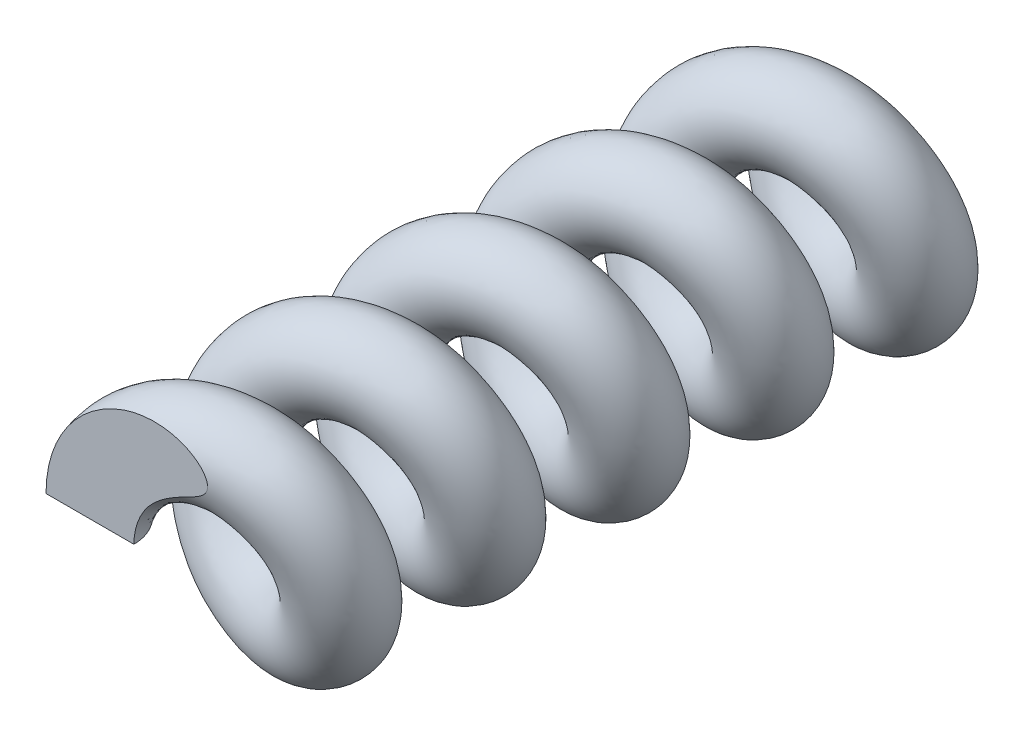
ISO-10303-21;
HEADER;
FILE_DESCRIPTION(('STEP AP214'),'2;1');
FILE_NAME('part.step','',(''),(''),'','','');
FILE_SCHEMA(('AUTOMOTIVE_DESIGN { 1 0 10303 214 1 1 1 1 }'));
ENDSEC;
DATA;
#1=APPLICATION_CONTEXT('core data for automotive mechanical design processes');
#2=APPLICATION_PROTOCOL_DEFINITION('international standard','automotive_design',2000,#1);
#3=PRODUCT_CONTEXT('',#1,'mechanical');
#4=PRODUCT('Part','Part','',(#3));
#5=PRODUCT_RELATED_PRODUCT_CATEGORY('part','',(#4));
#6=PRODUCT_DEFINITION_FORMATION('','',#4);
#7=PRODUCT_DEFINITION_CONTEXT('part definition',#1,'design');
#8=PRODUCT_DEFINITION('design','',#6,#7);
#9=PRODUCT_DEFINITION_SHAPE('','',#8);
#10=(LENGTH_UNIT() NAMED_UNIT(*) SI_UNIT(.MILLI.,.METRE.));
#11=(NAMED_UNIT(*) PLANE_ANGLE_UNIT() SI_UNIT($,.RADIAN.));
#12=(NAMED_UNIT(*) SI_UNIT($,.STERADIAN.) SOLID_ANGLE_UNIT());
#13=UNCERTAINTY_MEASURE_WITH_UNIT(LENGTH_MEASURE(1.E-05),#10,'distance_accuracy_value','');
#14=(GEOMETRIC_REPRESENTATION_CONTEXT(3) GLOBAL_UNCERTAINTY_ASSIGNED_CONTEXT((#13)) GLOBAL_UNIT_ASSIGNED_CONTEXT((#10,
#11,#12)) REPRESENTATION_CONTEXT('',''));
#15=CARTESIAN_POINT('',(0.,0.,0.));
#16=DIRECTION('',(0.,0.,1.));
#17=DIRECTION('',(1.,0.,0.));
#18=AXIS2_PLACEMENT_3D('',#15,#16,#17);
#19=CARTESIAN_POINT('',(-0.5,0.,0.));
#20=DIRECTION('',(0.,1.,0.));
#21=DIRECTION('',(0.,0.,1.));
#22=AXIS2_PLACEMENT_3D('',#19,#20,#21);
#23=PLANE('',#22);
#24=DIRECTION('',(1.,0.,0.));
#25=VECTOR('',#24,1.);
#26=CARTESIAN_POINT('',(-0.5,0.,0.));
#27=LINE('',#26,#25);
#28=CARTESIAN_POINT('',(-0.75,0.,0.));
#29=VERTEX_POINT('',#28);
#30=CARTESIAN_POINT('',(-0.25,0.,0.));
#31=VERTEX_POINT('',#30);
#32=EDGE_CURVE('E55',#29,#31,#27,.T.);
#33=ORIENTED_EDGE('',*,*,#32,.F.);
#34=CARTESIAN_POINT('',(-0.5,0.,0.));
#35=DIRECTION('',(0.,1.,0.));
#36=DIRECTION('',(0.,0.,1.));
#37=AXIS2_PLACEMENT_3D('',#34,#35,#36);
#38=CIRCLE('',#37,0.25);
#39=EDGE_CURVE('E70',#31,#29,#38,.T.);
#40=ORIENTED_EDGE('',*,*,#39,.F.);
#41=EDGE_LOOP('',(#33,#40));
#42=FACE_BOUND('',#41,.T.);
#43=ADVANCED_FACE('F36',(#42),#23,.F.);
#44=CARTESIAN_POINT('',(-0.5,0.,0.25));
#45=CARTESIAN_POINT('',(-0.5,0.288675134594813,0.181729812479405));
#46=CARTESIAN_POINT('',(-0.25,0.433012701892219,0.11345962495881));
#47=CARTESIAN_POINT('',(0.,0.577350269189626,0.0451894374382147));
#48=CARTESIAN_POINT('',(0.25,0.433012701892219,-0.0230807500823805));
#49=CARTESIAN_POINT('',(0.5,0.288675134594813,-0.0913509376029756));
#50=CARTESIAN_POINT('',(0.5,0.,-0.159621125123571));
#51=CARTESIAN_POINT('',(0.5,-0.288675134594813,-0.227891312644166));
#52=CARTESIAN_POINT('',(0.25,-0.433012701892219,-0.296161500164761));
#53=CARTESIAN_POINT('',(0.,-0.577350269189626,-0.364431687685356));
#54=CARTESIAN_POINT('',(-0.25,-0.43301270189222,-0.432701875205951));
#55=CARTESIAN_POINT('',(-0.5,-0.288675134594813,-0.500972062726546));
#56=CARTESIAN_POINT('',(-0.5,0.,-0.569242250247142));
#57=CARTESIAN_POINT('',(-0.5,0.288675134594813,-0.637512437767737));
#58=CARTESIAN_POINT('',(-0.25,0.433012701892219,-0.705782625288332));
#59=CARTESIAN_POINT('',(0.,0.577350269189626,-0.774052812808927));
#60=CARTESIAN_POINT('',(0.25,0.433012701892219,-0.842323000329522));
#61=CARTESIAN_POINT('',(0.5,0.288675134594813,-0.910593187850117));
#62=CARTESIAN_POINT('',(0.5,0.,-0.978863375370712));
#63=CARTESIAN_POINT('',(0.5,-0.288675134594813,-1.04713356289131));
#64=CARTESIAN_POINT('',(0.25,-0.433012701892219,-1.1154037504119));
#65=CARTESIAN_POINT('',(0.,-0.577350269189626,-1.1836739379325));
#66=CARTESIAN_POINT('',(-0.25,-0.43301270189222,-1.25194412545309));
#67=CARTESIAN_POINT('',(-0.5,-0.288675134594813,-1.32021431297369));
#68=CARTESIAN_POINT('',(-0.5,0.,-1.38848450049428));
#69=CARTESIAN_POINT('',(-0.5,0.288675134594813,-1.45675468801488));
#70=CARTESIAN_POINT('',(-0.25,0.433012701892219,-1.52502487553547));
#71=CARTESIAN_POINT('',(0.,0.577350269189626,-1.59329506305607));
#72=CARTESIAN_POINT('',(0.25,0.433012701892219,-1.66156525057666));
#73=CARTESIAN_POINT('',(0.5,0.288675134594813,-1.72983543809726));
#74=CARTESIAN_POINT('',(0.5,0.,-1.79810562561785));
#75=CARTESIAN_POINT('',(0.5,-0.288675134594813,-1.86637581313845));
#76=CARTESIAN_POINT('',(0.25,-0.433012701892219,-1.93464600065904));
#77=CARTESIAN_POINT('',(0.,-0.577350269189626,-2.00291618817964));
#78=CARTESIAN_POINT('',(-0.25,-0.43301270189222,-2.07118637570023));
#79=CARTESIAN_POINT('',(-0.5,-0.288675134594813,-2.13945656322083));
#80=CARTESIAN_POINT('',(-0.5,0.,-2.20772675074143));
#81=CARTESIAN_POINT('',(-0.5,0.288675134594813,-2.27599693826202));
#82=CARTESIAN_POINT('',(-0.25,0.433012701892219,-2.34426712578262));
#83=CARTESIAN_POINT('',(0.,0.577350269189626,-2.41253731330321));
#84=CARTESIAN_POINT('',(0.25,0.433012701892219,-2.48080750082381));
#85=CARTESIAN_POINT('',(0.5,0.288675134594813,-2.5490776883444));
#86=CARTESIAN_POINT('',(0.5,0.,-2.617347875865));
#87=CARTESIAN_POINT('',(0.5,-0.288675134594813,-2.68561806338559));
#88=CARTESIAN_POINT('',(0.25,-0.433012701892219,-2.75388825090619));
#89=CARTESIAN_POINT('',(0.,-0.577350269189626,-2.82215843842678));
#90=CARTESIAN_POINT('',(-0.25,-0.43301270189222,-2.89042862594738));
#91=CARTESIAN_POINT('',(-0.5,-0.288675134594813,-2.95869881346797));
#92=CARTESIAN_POINT('',(-0.5,0.,-3.02696900098857));
#93=CARTESIAN_POINT('',(-0.5,0.288675134594813,-3.09523918850916));
#94=CARTESIAN_POINT('',(-0.25,0.433012701892219,-3.16350937602976));
#95=CARTESIAN_POINT('',(0.,0.577350269189626,-3.23177956355035));
#96=CARTESIAN_POINT('',(0.25,0.433012701892219,-3.30004975107095));
#97=CARTESIAN_POINT('',(0.5,0.288675134594813,-3.36831993859154));
#98=CARTESIAN_POINT('',(0.5,0.,-3.43659012611214));
#99=CARTESIAN_POINT('',(0.5,-0.288675134594813,-3.50486031363273));
#100=CARTESIAN_POINT('',(0.25,-0.433012701892219,-3.57313050115333));
#101=CARTESIAN_POINT('',(0.,-0.577350269189626,-3.64140068867392));
#102=CARTESIAN_POINT('',(-0.25,-0.43301270189222,-3.70967087619452));
#103=CARTESIAN_POINT('',(-0.5,-0.288675134594813,-3.77794106371511));
#104=CARTESIAN_POINT('',(-0.5,0.,-3.84621125123571));
#105=CARTESIAN_POINT('',(0.,0.,0.25));
#106=CARTESIAN_POINT('',(0.,0.,0.181729812479405));
#107=CARTESIAN_POINT('',(0.,0.,0.11345962495881));
#108=CARTESIAN_POINT('',(0.,0.,0.0451894374382147));
#109=CARTESIAN_POINT('',(0.,0.,-0.0230807500823805));
#110=CARTESIAN_POINT('',(0.,0.,-0.0913509376029756));
#111=CARTESIAN_POINT('',(0.,0.,-0.159621125123571));
#112=CARTESIAN_POINT('',(0.,0.,-0.227891312644166));
#113=CARTESIAN_POINT('',(0.,0.,-0.296161500164761));
#114=CARTESIAN_POINT('',(0.,0.,-0.364431687685356));
#115=CARTESIAN_POINT('',(0.,0.,-0.432701875205951));
#116=CARTESIAN_POINT('',(0.,0.,-0.500972062726546));
#117=CARTESIAN_POINT('',(0.,0.,-0.569242250247142));
#118=CARTESIAN_POINT('',(0.,0.,-0.637512437767737));
#119=CARTESIAN_POINT('',(0.,0.,-0.705782625288332));
#120=CARTESIAN_POINT('',(0.,0.,-0.774052812808927));
#121=CARTESIAN_POINT('',(0.,0.,-0.842323000329522));
#122=CARTESIAN_POINT('',(0.,0.,-0.910593187850117));
#123=CARTESIAN_POINT('',(0.,0.,-0.978863375370712));
#124=CARTESIAN_POINT('',(0.,0.,-1.04713356289131));
#125=CARTESIAN_POINT('',(0.,0.,-1.1154037504119));
#126=CARTESIAN_POINT('',(0.,0.,-1.1836739379325));
#127=CARTESIAN_POINT('',(0.,0.,-1.25194412545309));
#128=CARTESIAN_POINT('',(0.,0.,-1.32021431297369));
#129=CARTESIAN_POINT('',(0.,0.,-1.38848450049428));
#130=CARTESIAN_POINT('',(0.,0.,-1.45675468801488));
#131=CARTESIAN_POINT('',(0.,0.,-1.52502487553547));
#132=CARTESIAN_POINT('',(0.,0.,-1.59329506305607));
#133=CARTESIAN_POINT('',(0.,0.,-1.66156525057666));
#134=CARTESIAN_POINT('',(0.,0.,-1.72983543809726));
#135=CARTESIAN_POINT('',(0.,0.,-1.79810562561785));
#136=CARTESIAN_POINT('',(0.,0.,-1.86637581313845));
#137=CARTESIAN_POINT('',(0.,0.,-1.93464600065904));
#138=CARTESIAN_POINT('',(0.,0.,-2.00291618817964));
#139=CARTESIAN_POINT('',(0.,0.,-2.07118637570023));
#140=CARTESIAN_POINT('',(0.,0.,-2.13945656322083));
#141=CARTESIAN_POINT('',(0.,0.,-2.20772675074143));
#142=CARTESIAN_POINT('',(0.,0.,-2.27599693826202));
#143=CARTESIAN_POINT('',(0.,0.,-2.34426712578262));
#144=CARTESIAN_POINT('',(0.,0.,-2.41253731330321));
#145=CARTESIAN_POINT('',(0.,0.,-2.48080750082381));
#146=CARTESIAN_POINT('',(0.,0.,-2.5490776883444));
#147=CARTESIAN_POINT('',(0.,0.,-2.617347875865));
#148=CARTESIAN_POINT('',(0.,0.,-2.68561806338559));
#149=CARTESIAN_POINT('',(0.,0.,-2.75388825090619));
#150=CARTESIAN_POINT('',(0.,0.,-2.82215843842678));
#151=CARTESIAN_POINT('',(0.,0.,-2.89042862594738));
#152=CARTESIAN_POINT('',(0.,0.,-2.95869881346797));
#153=CARTESIAN_POINT('',(0.,0.,-3.02696900098857));
#154=CARTESIAN_POINT('',(0.,0.,-3.09523918850916));
#155=CARTESIAN_POINT('',(0.,0.,-3.16350937602976));
#156=CARTESIAN_POINT('',(0.,0.,-3.23177956355035));
#157=CARTESIAN_POINT('',(0.,0.,-3.30004975107095));
#158=CARTESIAN_POINT('',(0.,0.,-3.36831993859154));
#159=CARTESIAN_POINT('',(0.,0.,-3.43659012611214));
#160=CARTESIAN_POINT('',(0.,0.,-3.50486031363273));
#161=CARTESIAN_POINT('',(0.,0.,-3.57313050115333));
#162=CARTESIAN_POINT('',(0.,0.,-3.64140068867392));
#163=CARTESIAN_POINT('',(0.,0.,-3.70967087619452));
#164=CARTESIAN_POINT('',(0.,0.,-3.77794106371511));
#165=CARTESIAN_POINT('',(0.,0.,-3.84621125123571));
#166=CARTESIAN_POINT('',(0.,0.,-0.25));
#167=CARTESIAN_POINT('',(0.,0.,-0.318270187520595));
#168=CARTESIAN_POINT('',(0.,0.,-0.38654037504119));
#169=CARTESIAN_POINT('',(0.,0.,-0.454810562561785));
#170=CARTESIAN_POINT('',(0.,0.,-0.523080750082381));
#171=CARTESIAN_POINT('',(0.,0.,-0.591350937602976));
#172=CARTESIAN_POINT('',(0.,0.,-0.659621125123571));
#173=CARTESIAN_POINT('',(0.,0.,-0.727891312644166));
#174=CARTESIAN_POINT('',(0.,0.,-0.796161500164761));
#175=CARTESIAN_POINT('',(0.,0.,-0.864431687685356));
#176=CARTESIAN_POINT('',(0.,0.,-0.932701875205951));
#177=CARTESIAN_POINT('',(0.,0.,-1.00097206272655));
#178=CARTESIAN_POINT('',(0.,0.,-1.06924225024714));
#179=CARTESIAN_POINT('',(0.,0.,-1.13751243776774));
#180=CARTESIAN_POINT('',(0.,0.,-1.20578262528833));
#181=CARTESIAN_POINT('',(0.,0.,-1.27405281280893));
#182=CARTESIAN_POINT('',(0.,0.,-1.34232300032952));
#183=CARTESIAN_POINT('',(0.,0.,-1.41059318785012));
#184=CARTESIAN_POINT('',(0.,0.,-1.47886337537071));
#185=CARTESIAN_POINT('',(0.,0.,-1.54713356289131));
#186=CARTESIAN_POINT('',(0.,0.,-1.6154037504119));
#187=CARTESIAN_POINT('',(0.,0.,-1.6836739379325));
#188=CARTESIAN_POINT('',(0.,0.,-1.75194412545309));
#189=CARTESIAN_POINT('',(0.,0.,-1.82021431297369));
#190=CARTESIAN_POINT('',(0.,0.,-1.88848450049428));
#191=CARTESIAN_POINT('',(0.,0.,-1.95675468801488));
#192=CARTESIAN_POINT('',(0.,0.,-2.02502487553547));
#193=CARTESIAN_POINT('',(0.,0.,-2.09329506305607));
#194=CARTESIAN_POINT('',(0.,0.,-2.16156525057666));
#195=CARTESIAN_POINT('',(0.,0.,-2.22983543809726));
#196=CARTESIAN_POINT('',(0.,0.,-2.29810562561785));
#197=CARTESIAN_POINT('',(0.,0.,-2.36637581313845));
#198=CARTESIAN_POINT('',(0.,0.,-2.43464600065904));
#199=CARTESIAN_POINT('',(0.,0.,-2.50291618817964));
#200=CARTESIAN_POINT('',(0.,0.,-2.57118637570023));
#201=CARTESIAN_POINT('',(0.,0.,-2.63945656322083));
#202=CARTESIAN_POINT('',(0.,0.,-2.70772675074143));
#203=CARTESIAN_POINT('',(0.,0.,-2.77599693826202));
#204=CARTESIAN_POINT('',(0.,0.,-2.84426712578262));
#205=CARTESIAN_POINT('',(0.,0.,-2.91253731330321));
#206=CARTESIAN_POINT('',(0.,0.,-2.98080750082381));
#207=CARTESIAN_POINT('',(0.,0.,-3.0490776883444));
#208=CARTESIAN_POINT('',(0.,0.,-3.117347875865));
#209=CARTESIAN_POINT('',(0.,0.,-3.18561806338559));
#210=CARTESIAN_POINT('',(0.,0.,-3.25388825090619));
#211=CARTESIAN_POINT('',(0.,0.,-3.32215843842678));
#212=CARTESIAN_POINT('',(0.,0.,-3.39042862594738));
#213=CARTESIAN_POINT('',(0.,0.,-3.45869881346797));
#214=CARTESIAN_POINT('',(0.,0.,-3.52696900098857));
#215=CARTESIAN_POINT('',(0.,0.,-3.59523918850916));
#216=CARTESIAN_POINT('',(0.,0.,-3.66350937602976));
#217=CARTESIAN_POINT('',(0.,0.,-3.73177956355035));
#218=CARTESIAN_POINT('',(0.,0.,-3.80004975107095));
#219=CARTESIAN_POINT('',(0.,0.,-3.86831993859154));
#220=CARTESIAN_POINT('',(0.,0.,-3.93659012611214));
#221=CARTESIAN_POINT('',(0.,0.,-4.00486031363273));
#222=CARTESIAN_POINT('',(0.,0.,-4.07313050115333));
#223=CARTESIAN_POINT('',(0.,0.,-4.14140068867392));
#224=CARTESIAN_POINT('',(0.,0.,-4.20967087619452));
#225=CARTESIAN_POINT('',(0.,0.,-4.27794106371511));
#226=CARTESIAN_POINT('',(0.,0.,-4.34621125123571));
#227=CARTESIAN_POINT('',(-0.5,0.,-0.25));
#228=CARTESIAN_POINT('',(-0.5,0.288675134594813,-0.318270187520595));
#229=CARTESIAN_POINT('',(-0.25,0.433012701892219,-0.38654037504119));
#230=CARTESIAN_POINT('',(0.,0.577350269189626,-0.454810562561785));
#231=CARTESIAN_POINT('',(0.25,0.433012701892219,-0.523080750082381));
#232=CARTESIAN_POINT('',(0.5,0.288675134594813,-0.591350937602976));
#233=CARTESIAN_POINT('',(0.5,0.,-0.659621125123571));
#234=CARTESIAN_POINT('',(0.5,-0.288675134594813,-0.727891312644166));
#235=CARTESIAN_POINT('',(0.25,-0.433012701892219,-0.796161500164761));
#236=CARTESIAN_POINT('',(0.,-0.577350269189626,-0.864431687685356));
#237=CARTESIAN_POINT('',(-0.25,-0.43301270189222,-0.932701875205951));
#238=CARTESIAN_POINT('',(-0.5,-0.288675134594813,-1.00097206272655));
#239=CARTESIAN_POINT('',(-0.5,0.,-1.06924225024714));
#240=CARTESIAN_POINT('',(-0.5,0.288675134594813,-1.13751243776774));
#241=CARTESIAN_POINT('',(-0.25,0.433012701892219,-1.20578262528833));
#242=CARTESIAN_POINT('',(0.,0.577350269189626,-1.27405281280893));
#243=CARTESIAN_POINT('',(0.25,0.433012701892219,-1.34232300032952));
#244=CARTESIAN_POINT('',(0.5,0.288675134594813,-1.41059318785012));
#245=CARTESIAN_POINT('',(0.5,0.,-1.47886337537071));
#246=CARTESIAN_POINT('',(0.5,-0.288675134594813,-1.54713356289131));
#247=CARTESIAN_POINT('',(0.25,-0.433012701892219,-1.6154037504119));
#248=CARTESIAN_POINT('',(0.,-0.577350269189626,-1.6836739379325));
#249=CARTESIAN_POINT('',(-0.25,-0.43301270189222,-1.75194412545309));
#250=CARTESIAN_POINT('',(-0.5,-0.288675134594813,-1.82021431297369));
#251=CARTESIAN_POINT('',(-0.5,0.,-1.88848450049428));
#252=CARTESIAN_POINT('',(-0.5,0.288675134594813,-1.95675468801488));
#253=CARTESIAN_POINT('',(-0.25,0.433012701892219,-2.02502487553547));
#254=CARTESIAN_POINT('',(0.,0.577350269189626,-2.09329506305607));
#255=CARTESIAN_POINT('',(0.25,0.433012701892219,-2.16156525057666));
#256=CARTESIAN_POINT('',(0.5,0.288675134594813,-2.22983543809726));
#257=CARTESIAN_POINT('',(0.5,0.,-2.29810562561785));
#258=CARTESIAN_POINT('',(0.5,-0.288675134594813,-2.36637581313845));
#259=CARTESIAN_POINT('',(0.25,-0.433012701892219,-2.43464600065904));
#260=CARTESIAN_POINT('',(0.,-0.577350269189626,-2.50291618817964));
#261=CARTESIAN_POINT('',(-0.25,-0.43301270189222,-2.57118637570024));
#262=CARTESIAN_POINT('',(-0.5,-0.288675134594813,-2.63945656322083));
#263=CARTESIAN_POINT('',(-0.5,0.,-2.70772675074143));
#264=CARTESIAN_POINT('',(-0.5,0.288675134594813,-2.77599693826202));
#265=CARTESIAN_POINT('',(-0.25,0.433012701892219,-2.84426712578262));
#266=CARTESIAN_POINT('',(0.,0.577350269189626,-2.91253731330321));
#267=CARTESIAN_POINT('',(0.25,0.433012701892219,-2.98080750082381));
#268=CARTESIAN_POINT('',(0.5,0.288675134594813,-3.0490776883444));
#269=CARTESIAN_POINT('',(0.5,0.,-3.117347875865));
#270=CARTESIAN_POINT('',(0.5,-0.288675134594813,-3.18561806338559));
#271=CARTESIAN_POINT('',(0.25,-0.433012701892219,-3.25388825090619));
#272=CARTESIAN_POINT('',(0.,-0.577350269189626,-3.32215843842678));
#273=CARTESIAN_POINT('',(-0.25,-0.43301270189222,-3.39042862594738));
#274=CARTESIAN_POINT('',(-0.5,-0.288675134594813,-3.45869881346797));
#275=CARTESIAN_POINT('',(-0.5,0.,-3.52696900098857));
#276=CARTESIAN_POINT('',(-0.5,0.288675134594813,-3.59523918850916));
#277=CARTESIAN_POINT('',(-0.25,0.433012701892219,-3.66350937602976));
#278=CARTESIAN_POINT('',(0.,0.577350269189626,-3.73177956355035));
#279=CARTESIAN_POINT('',(0.25,0.433012701892219,-3.80004975107095));
#280=CARTESIAN_POINT('',(0.5,0.288675134594813,-3.86831993859154));
#281=CARTESIAN_POINT('',(0.5,0.,-3.93659012611214));
#282=CARTESIAN_POINT('',(0.5,-0.288675134594813,-4.00486031363273));
#283=CARTESIAN_POINT('',(0.25,-0.433012701892219,-4.07313050115333));
#284=CARTESIAN_POINT('',(0.,-0.577350269189626,-4.14140068867392));
#285=CARTESIAN_POINT('',(-0.25,-0.43301270189222,-4.20967087619452));
#286=CARTESIAN_POINT('',(-0.5,-0.288675134594813,-4.27794106371511));
#287=CARTESIAN_POINT('',(-0.5,0.,-4.34621125123571));
#288=CARTESIAN_POINT('',(-1.,0.,-0.25));
#289=CARTESIAN_POINT('',(-1.,0.577350269189626,-0.318270187520595));
#290=CARTESIAN_POINT('',(-0.5,0.866025403784439,-0.38654037504119));
#291=CARTESIAN_POINT('',(0.,1.15470053837925,-0.454810562561785));
#292=CARTESIAN_POINT('',(0.5,0.866025403784439,-0.523080750082381));
#293=CARTESIAN_POINT('',(1.,0.577350269189626,-0.591350937602976));
#294=CARTESIAN_POINT('',(1.,0.,-0.659621125123571));
#295=CARTESIAN_POINT('',(1.,-0.577350269189625,-0.727891312644166));
#296=CARTESIAN_POINT('',(0.5,-0.866025403784438,-0.796161500164761));
#297=CARTESIAN_POINT('',(0.,-1.15470053837925,-0.864431687685356));
#298=CARTESIAN_POINT('',(-0.499999999999999,-0.866025403784439,-0.932701875205952));
#299=CARTESIAN_POINT('',(-1.,-0.577350269189626,-1.00097206272655));
#300=CARTESIAN_POINT('',(-1.,0.,-1.06924225024714));
#301=CARTESIAN_POINT('',(-1.,0.577350269189626,-1.13751243776774));
#302=CARTESIAN_POINT('',(-0.5,0.866025403784439,-1.20578262528833));
#303=CARTESIAN_POINT('',(0.,1.15470053837925,-1.27405281280893));
#304=CARTESIAN_POINT('',(0.5,0.866025403784439,-1.34232300032952));
#305=CARTESIAN_POINT('',(1.,0.577350269189626,-1.41059318785012));
#306=CARTESIAN_POINT('',(1.,0.,-1.47886337537071));
#307=CARTESIAN_POINT('',(1.,-0.577350269189625,-1.54713356289131));
#308=CARTESIAN_POINT('',(0.5,-0.866025403784438,-1.6154037504119));
#309=CARTESIAN_POINT('',(0.,-1.15470053837925,-1.6836739379325));
#310=CARTESIAN_POINT('',(-0.499999999999999,-0.866025403784439,-1.75194412545309));
#311=CARTESIAN_POINT('',(-1.,-0.577350269189626,-1.82021431297369));
#312=CARTESIAN_POINT('',(-1.,0.,-1.88848450049428));
#313=CARTESIAN_POINT('',(-1.,0.577350269189626,-1.95675468801488));
#314=CARTESIAN_POINT('',(-0.5,0.866025403784439,-2.02502487553547));
#315=CARTESIAN_POINT('',(0.,1.15470053837925,-2.09329506305607));
#316=CARTESIAN_POINT('',(0.5,0.866025403784439,-2.16156525057666));
#317=CARTESIAN_POINT('',(1.,0.577350269189626,-2.22983543809726));
#318=CARTESIAN_POINT('',(1.,0.,-2.29810562561785));
#319=CARTESIAN_POINT('',(1.,-0.577350269189625,-2.36637581313845));
#320=CARTESIAN_POINT('',(0.5,-0.866025403784438,-2.43464600065904));
#321=CARTESIAN_POINT('',(0.,-1.15470053837925,-2.50291618817964));
#322=CARTESIAN_POINT('',(-0.499999999999999,-0.866025403784439,-2.57118637570024));
#323=CARTESIAN_POINT('',(-1.,-0.577350269189626,-2.63945656322083));
#324=CARTESIAN_POINT('',(-1.,0.,-2.70772675074143));
#325=CARTESIAN_POINT('',(-1.,0.577350269189626,-2.77599693826202));
#326=CARTESIAN_POINT('',(-0.5,0.866025403784439,-2.84426712578262));
#327=CARTESIAN_POINT('',(0.,1.15470053837925,-2.91253731330321));
#328=CARTESIAN_POINT('',(0.5,0.866025403784439,-2.98080750082381));
#329=CARTESIAN_POINT('',(1.,0.577350269189626,-3.0490776883444));
#330=CARTESIAN_POINT('',(1.,0.,-3.117347875865));
#331=CARTESIAN_POINT('',(1.,-0.577350269189625,-3.18561806338559));
#332=CARTESIAN_POINT('',(0.5,-0.866025403784438,-3.25388825090619));
#333=CARTESIAN_POINT('',(0.,-1.15470053837925,-3.32215843842678));
#334=CARTESIAN_POINT('',(-0.499999999999999,-0.866025403784439,-3.39042862594738));
#335=CARTESIAN_POINT('',(-1.,-0.577350269189626,-3.45869881346797));
#336=CARTESIAN_POINT('',(-1.,0.,-3.52696900098857));
#337=CARTESIAN_POINT('',(-1.,0.577350269189626,-3.59523918850916));
#338=CARTESIAN_POINT('',(-0.5,0.866025403784439,-3.66350937602976));
#339=CARTESIAN_POINT('',(0.,1.15470053837925,-3.73177956355035));
#340=CARTESIAN_POINT('',(0.5,0.866025403784439,-3.80004975107095));
#341=CARTESIAN_POINT('',(1.,0.577350269189626,-3.86831993859154));
#342=CARTESIAN_POINT('',(1.,0.,-3.93659012611214));
#343=CARTESIAN_POINT('',(1.,-0.577350269189625,-4.00486031363273));
#344=CARTESIAN_POINT('',(0.5,-0.866025403784438,-4.07313050115333));
#345=CARTESIAN_POINT('',(0.,-1.15470053837925,-4.14140068867392));
#346=CARTESIAN_POINT('',(-0.499999999999999,-0.866025403784439,-4.20967087619452));
#347=CARTESIAN_POINT('',(-1.,-0.577350269189626,-4.27794106371511));
#348=CARTESIAN_POINT('',(-1.,0.,-4.34621125123571));
#349=CARTESIAN_POINT('',(-1.,0.,0.25));
#350=CARTESIAN_POINT('',(-1.,0.577350269189626,0.181729812479405));
#351=CARTESIAN_POINT('',(-0.5,0.866025403784439,0.11345962495881));
#352=CARTESIAN_POINT('',(0.,1.15470053837925,0.0451894374382147));
#353=CARTESIAN_POINT('',(0.5,0.866025403784439,-0.0230807500823805));
#354=CARTESIAN_POINT('',(1.,0.577350269189626,-0.0913509376029756));
#355=CARTESIAN_POINT('',(1.,0.,-0.159621125123571));
#356=CARTESIAN_POINT('',(1.,-0.577350269189625,-0.227891312644166));
#357=CARTESIAN_POINT('',(0.5,-0.866025403784438,-0.296161500164761));
#358=CARTESIAN_POINT('',(0.,-1.15470053837925,-0.364431687685356));
#359=CARTESIAN_POINT('',(-0.499999999999999,-0.866025403784439,-0.432701875205951));
#360=CARTESIAN_POINT('',(-1.,-0.577350269189626,-0.500972062726546));
#361=CARTESIAN_POINT('',(-1.,0.,-0.569242250247142));
#362=CARTESIAN_POINT('',(-1.,0.577350269189626,-0.637512437767737));
#363=CARTESIAN_POINT('',(-0.5,0.866025403784439,-0.705782625288332));
#364=CARTESIAN_POINT('',(0.,1.15470053837925,-0.774052812808927));
#365=CARTESIAN_POINT('',(0.5,0.866025403784439,-0.842323000329522));
#366=CARTESIAN_POINT('',(1.,0.577350269189626,-0.910593187850117));
#367=CARTESIAN_POINT('',(1.,0.,-0.978863375370712));
#368=CARTESIAN_POINT('',(1.,-0.577350269189625,-1.04713356289131));
#369=CARTESIAN_POINT('',(0.5,-0.866025403784438,-1.1154037504119));
#370=CARTESIAN_POINT('',(0.,-1.15470053837925,-1.1836739379325));
#371=CARTESIAN_POINT('',(-0.499999999999999,-0.866025403784439,-1.25194412545309));
#372=CARTESIAN_POINT('',(-1.,-0.577350269189626,-1.32021431297369));
#373=CARTESIAN_POINT('',(-1.,0.,-1.38848450049428));
#374=CARTESIAN_POINT('',(-1.,0.577350269189626,-1.45675468801488));
#375=CARTESIAN_POINT('',(-0.5,0.866025403784439,-1.52502487553547));
#376=CARTESIAN_POINT('',(0.,1.15470053837925,-1.59329506305607));
#377=CARTESIAN_POINT('',(0.5,0.866025403784439,-1.66156525057666));
#378=CARTESIAN_POINT('',(1.,0.577350269189626,-1.72983543809726));
#379=CARTESIAN_POINT('',(1.,0.,-1.79810562561785));
#380=CARTESIAN_POINT('',(1.,-0.577350269189625,-1.86637581313845));
#381=CARTESIAN_POINT('',(0.5,-0.866025403784438,-1.93464600065904));
#382=CARTESIAN_POINT('',(0.,-1.15470053837925,-2.00291618817964));
#383=CARTESIAN_POINT('',(-0.499999999999999,-0.866025403784439,-2.07118637570023));
#384=CARTESIAN_POINT('',(-1.,-0.577350269189626,-2.13945656322083));
#385=CARTESIAN_POINT('',(-1.,0.,-2.20772675074143));
#386=CARTESIAN_POINT('',(-1.,0.577350269189626,-2.27599693826202));
#387=CARTESIAN_POINT('',(-0.5,0.866025403784439,-2.34426712578262));
#388=CARTESIAN_POINT('',(0.,1.15470053837925,-2.41253731330321));
#389=CARTESIAN_POINT('',(0.5,0.866025403784439,-2.48080750082381));
#390=CARTESIAN_POINT('',(1.,0.577350269189626,-2.5490776883444));
#391=CARTESIAN_POINT('',(1.,0.,-2.617347875865));
#392=CARTESIAN_POINT('',(1.,-0.577350269189625,-2.68561806338559));
#393=CARTESIAN_POINT('',(0.5,-0.866025403784438,-2.75388825090619));
#394=CARTESIAN_POINT('',(0.,-1.15470053837925,-2.82215843842678));
#395=CARTESIAN_POINT('',(-0.499999999999999,-0.866025403784439,-2.89042862594738));
#396=CARTESIAN_POINT('',(-1.,-0.577350269189626,-2.95869881346797));
#397=CARTESIAN_POINT('',(-1.,0.,-3.02696900098857));
#398=CARTESIAN_POINT('',(-1.,0.577350269189626,-3.09523918850916));
#399=CARTESIAN_POINT('',(-0.5,0.866025403784439,-3.16350937602976));
#400=CARTESIAN_POINT('',(0.,1.15470053837925,-3.23177956355035));
#401=CARTESIAN_POINT('',(0.5,0.866025403784439,-3.30004975107095));
#402=CARTESIAN_POINT('',(1.,0.577350269189626,-3.36831993859154));
#403=CARTESIAN_POINT('',(1.,0.,-3.43659012611214));
#404=CARTESIAN_POINT('',(1.,-0.577350269189625,-3.50486031363273));
#405=CARTESIAN_POINT('',(0.5,-0.866025403784438,-3.57313050115333));
#406=CARTESIAN_POINT('',(0.,-1.15470053837925,-3.64140068867392));
#407=CARTESIAN_POINT('',(-0.499999999999999,-0.866025403784439,-3.70967087619452));
#408=CARTESIAN_POINT('',(-1.,-0.577350269189626,-3.77794106371511));
#409=CARTESIAN_POINT('',(-1.,0.,-3.84621125123571));
#410=CARTESIAN_POINT('',(-0.5,0.,0.25));
#411=CARTESIAN_POINT('',(-0.5,0.288675134594813,0.181729812479405));
#412=CARTESIAN_POINT('',(-0.25,0.433012701892219,0.11345962495881));
#413=CARTESIAN_POINT('',(0.,0.577350269189626,0.0451894374382147));
#414=CARTESIAN_POINT('',(0.25,0.433012701892219,-0.0230807500823805));
#415=CARTESIAN_POINT('',(0.5,0.288675134594813,-0.0913509376029756));
#416=CARTESIAN_POINT('',(0.5,0.,-0.159621125123571));
#417=CARTESIAN_POINT('',(0.5,-0.288675134594813,-0.227891312644166));
#418=CARTESIAN_POINT('',(0.25,-0.433012701892219,-0.296161500164761));
#419=CARTESIAN_POINT('',(0.,-0.577350269189626,-0.364431687685356));
#420=CARTESIAN_POINT('',(-0.25,-0.43301270189222,-0.432701875205951));
#421=CARTESIAN_POINT('',(-0.5,-0.288675134594813,-0.500972062726546));
#422=CARTESIAN_POINT('',(-0.5,0.,-0.569242250247142));
#423=CARTESIAN_POINT('',(-0.5,0.288675134594813,-0.637512437767737));
#424=CARTESIAN_POINT('',(-0.25,0.433012701892219,-0.705782625288332));
#425=CARTESIAN_POINT('',(0.,0.577350269189626,-0.774052812808927));
#426=CARTESIAN_POINT('',(0.25,0.433012701892219,-0.842323000329522));
#427=CARTESIAN_POINT('',(0.5,0.288675134594813,-0.910593187850117));
#428=CARTESIAN_POINT('',(0.5,0.,-0.978863375370712));
#429=CARTESIAN_POINT('',(0.5,-0.288675134594813,-1.04713356289131));
#430=CARTESIAN_POINT('',(0.25,-0.433012701892219,-1.1154037504119));
#431=CARTESIAN_POINT('',(0.,-0.577350269189626,-1.1836739379325));
#432=CARTESIAN_POINT('',(-0.25,-0.43301270189222,-1.25194412545309));
#433=CARTESIAN_POINT('',(-0.5,-0.288675134594813,-1.32021431297369));
#434=CARTESIAN_POINT('',(-0.5,0.,-1.38848450049428));
#435=CARTESIAN_POINT('',(-0.5,0.288675134594813,-1.45675468801488));
#436=CARTESIAN_POINT('',(-0.25,0.433012701892219,-1.52502487553547));
#437=CARTESIAN_POINT('',(0.,0.577350269189626,-1.59329506305607));
#438=CARTESIAN_POINT('',(0.25,0.433012701892219,-1.66156525057666));
#439=CARTESIAN_POINT('',(0.5,0.288675134594813,-1.72983543809726));
#440=CARTESIAN_POINT('',(0.5,0.,-1.79810562561785));
#441=CARTESIAN_POINT('',(0.5,-0.288675134594813,-1.86637581313845));
#442=CARTESIAN_POINT('',(0.25,-0.433012701892219,-1.93464600065904));
#443=CARTESIAN_POINT('',(0.,-0.577350269189626,-2.00291618817964));
#444=CARTESIAN_POINT('',(-0.25,-0.43301270189222,-2.07118637570023));
#445=CARTESIAN_POINT('',(-0.5,-0.288675134594813,-2.13945656322083));
#446=CARTESIAN_POINT('',(-0.5,0.,-2.20772675074143));
#447=CARTESIAN_POINT('',(-0.5,0.288675134594813,-2.27599693826202));
#448=CARTESIAN_POINT('',(-0.25,0.433012701892219,-2.34426712578262));
#449=CARTESIAN_POINT('',(0.,0.577350269189626,-2.41253731330321));
#450=CARTESIAN_POINT('',(0.25,0.433012701892219,-2.48080750082381));
#451=CARTESIAN_POINT('',(0.5,0.288675134594813,-2.5490776883444));
#452=CARTESIAN_POINT('',(0.5,0.,-2.617347875865));
#453=CARTESIAN_POINT('',(0.5,-0.288675134594813,-2.68561806338559));
#454=CARTESIAN_POINT('',(0.25,-0.433012701892219,-2.75388825090619));
#455=CARTESIAN_POINT('',(0.,-0.577350269189626,-2.82215843842678));
#456=CARTESIAN_POINT('',(-0.25,-0.43301270189222,-2.89042862594738));
#457=CARTESIAN_POINT('',(-0.5,-0.288675134594813,-2.95869881346797));
#458=CARTESIAN_POINT('',(-0.5,0.,-3.02696900098857));
#459=CARTESIAN_POINT('',(-0.5,0.288675134594813,-3.09523918850916));
#460=CARTESIAN_POINT('',(-0.25,0.433012701892219,-3.16350937602976));
#461=CARTESIAN_POINT('',(0.,0.577350269189626,-3.23177956355035));
#462=CARTESIAN_POINT('',(0.25,0.433012701892219,-3.30004975107095));
#463=CARTESIAN_POINT('',(0.5,0.288675134594813,-3.36831993859154));
#464=CARTESIAN_POINT('',(0.5,0.,-3.43659012611214));
#465=CARTESIAN_POINT('',(0.5,-0.288675134594813,-3.50486031363273));
#466=CARTESIAN_POINT('',(0.25,-0.433012701892219,-3.57313050115333));
#467=CARTESIAN_POINT('',(0.,-0.577350269189626,-3.64140068867392));
#468=CARTESIAN_POINT('',(-0.25,-0.43301270189222,-3.70967087619452));
#469=CARTESIAN_POINT('',(-0.5,-0.288675134594813,-3.77794106371511));
#470=CARTESIAN_POINT('',(-0.5,0.,-3.84621125123571));
#471=(BOUNDED_SURFACE() B_SPLINE_SURFACE(3,2,((#44,#45,#46,#47,#48,#49,#50,#51,#52,#53,#54,#55,
#56,#57,#58,#59,#60,#61,#62,#63,#64,#65,#66,#67,#68,#69,#70,#71,#72,#73,#74,#75,#76,#77,#78,#79,
#80,#81,#82,#83,#84,#85,#86,#87,#88,#89,#90,#91,#92,#93,#94,#95,#96,#97,#98,#99,#100,#101,#102,
#103,#104),(#105,#106,#107,#108,#109,#110,#111,#112,#113,#114,#115,#116,#117,#118,#119,#120,
#121,#122,#123,#124,#125,#126,#127,#128,#129,#130,#131,#132,#133,#134,#135,#136,#137,#138,#139,
#140,#141,#142,#143,#144,#145,#146,#147,#148,#149,#150,#151,#152,#153,#154,#155,#156,#157,#158,
#159,#160,#161,#162,#163,#164,#165),(#166,#167,#168,#169,#170,#171,#172,#173,#174,#175,#176,
#177,#178,#179,#180,#181,#182,#183,#184,#185,#186,#187,#188,#189,#190,#191,#192,#193,#194,#195,
#196,#197,#198,#199,#200,#201,#202,#203,#204,#205,#206,#207,#208,#209,#210,#211,#212,#213,#214,
#215,#216,#217,#218,#219,#220,#221,#222,#223,#224,#225,#226),(#227,#228,#229,#230,#231,#232,
#233,#234,#235,#236,#237,#238,#239,#240,#241,#242,#243,#244,#245,#246,#247,#248,#249,#250,#251,
#252,#253,#254,#255,#256,#257,#258,#259,#260,#261,#262,#263,#264,#265,#266,#267,#268,#269,#270,
#271,#272,#273,#274,#275,#276,#277,#278,#279,#280,#281,#282,#283,#284,#285,#286,#287),(#288,
#289,#290,#291,#292,#293,#294,#295,#296,#297,#298,#299,#300,#301,#302,#303,#304,#305,#306,#307,
#308,#309,#310,#311,#312,#313,#314,#315,#316,#317,#318,#319,#320,#321,#322,#323,#324,#325,#326,
#327,#328,#329,#330,#331,#332,#333,#334,#335,#336,#337,#338,#339,#340,#341,#342,#343,#344,#345,
#346,#347,#348),(#349,#350,#351,#352,#353,#354,#355,#356,#357,#358,#359,#360,#361,#362,#363,
#364,#365,#366,#367,#368,#369,#370,#371,#372,#373,#374,#375,#376,#377,#378,#379,#380,#381,#382,
#383,#384,#385,#386,#387,#388,#389,#390,#391,#392,#393,#394,#395,#396,#397,#398,#399,#400,#401,
#402,#403,#404,#405,#406,#407,#408,#409),(#410,#411,#412,#413,#414,#415,#416,#417,#418,#419,
#420,#421,#422,#423,#424,#425,#426,#427,#428,#429,#430,#431,#432,#433,#434,#435,#436,#437,#438,
#439,#440,#441,#442,#443,#444,#445,#446,#447,#448,#449,#450,#451,#452,#453,#454,#455,#456,#457,
#458,#459,#460,#461,#462,#463,#464,#465,#466,#467,#468,#469,#470)),.UNSPECIFIED.,.T.,.F.,
.F.) B_SPLINE_SURFACE_WITH_KNOTS((4,3,4),(3,2,2,2,2,2,2,2,2,2,2,2,2,2,2,2,2,2,2,2,2,2,2,2,2,2,2,
2,2,2,3),(0.,0.5,1.),(0.,0.0333333333333333,0.0666666666666667,0.1,0.133333333333333,
0.166666666666667,0.2,0.233333333333333,0.266666666666667,0.3,0.333333333333333,
0.366666666666667,0.4,0.433333333333333,0.466666666666667,0.5,0.533333333333333,
0.566666666666667,0.6,0.633333333333333,0.666666666666667,0.7,0.733333333333333,
0.766666666666667,0.8,0.833333333333333,0.866666666666667,0.9,0.933333333333333,
0.966666666666667,1.),
.UNSPECIFIED.) GEOMETRIC_REPRESENTATION_ITEM() RATIONAL_B_SPLINE_SURFACE(((1.,0.866025403784439,
1.,0.866025403784439,1.,0.866025403784439,1.,0.866025403784439,1.,0.866025403784439,1.,
0.866025403784439,1.,0.866025403784439,1.,0.866025403784439,1.,0.866025403784439,1.,
0.866025403784439,1.,0.866025403784439,1.,0.866025403784439,1.,0.866025403784439,1.,
0.866025403784439,1.,0.866025403784439,1.,0.866025403784439,1.,0.866025403784439,1.,
0.866025403784439,1.,0.866025403784439,1.,0.866025403784439,1.,0.866025403784439,1.,
0.866025403784439,1.,0.866025403784439,1.,0.866025403784439,1.,0.866025403784439,1.,
0.866025403784439,1.,0.866025403784439,1.,0.866025403784439,1.,0.866025403784439,1.,
0.866025403784439,1.),(0.333333333333333,0.288675134594813,0.333333333333333,0.288675134594813,
0.333333333333333,0.288675134594813,0.333333333333333,0.288675134594813,0.333333333333333,
0.288675134594813,0.333333333333333,0.288675134594813,0.333333333333333,0.288675134594813,
0.333333333333333,0.288675134594813,0.333333333333333,0.288675134594813,0.333333333333333,
0.288675134594813,0.333333333333333,0.288675134594813,0.333333333333333,0.288675134594813,
0.333333333333333,0.288675134594813,0.333333333333333,0.288675134594813,0.333333333333333,
0.288675134594813,0.333333333333333,0.288675134594813,0.333333333333333,0.288675134594813,
0.333333333333333,0.288675134594813,0.333333333333333,0.288675134594813,0.333333333333333,
0.288675134594813,0.333333333333333,0.288675134594813,0.333333333333333,0.288675134594813,
0.333333333333333,0.288675134594813,0.333333333333333,0.288675134594813,0.333333333333333,
0.288675134594813,0.333333333333333,0.288675134594813,0.333333333333333,0.288675134594813,
0.333333333333333,0.288675134594813,0.333333333333333,0.288675134594813,0.333333333333333,
0.288675134594813,0.333333333333333),(0.333333333333333,0.288675134594813,0.333333333333333,
0.288675134594813,0.333333333333333,0.288675134594813,0.333333333333333,0.288675134594813,
0.333333333333333,0.288675134594813,0.333333333333333,0.288675134594813,0.333333333333333,
0.288675134594813,0.333333333333333,0.288675134594813,0.333333333333333,0.288675134594813,
0.333333333333333,0.288675134594813,0.333333333333333,0.288675134594813,0.333333333333333,
0.288675134594813,0.333333333333333,0.288675134594813,0.333333333333333,0.288675134594813,
0.333333333333333,0.288675134594813,0.333333333333333,0.288675134594813,0.333333333333333,
0.288675134594813,0.333333333333333,0.288675134594813,0.333333333333333,0.288675134594813,
0.333333333333333,0.288675134594813,0.333333333333333,0.288675134594813,0.333333333333333,
0.288675134594813,0.333333333333333,0.288675134594813,0.333333333333333,0.288675134594813,
0.333333333333333,0.288675134594813,0.333333333333333,0.288675134594813,0.333333333333333,
0.288675134594813,0.333333333333333,0.288675134594813,0.333333333333333,0.288675134594813,
0.333333333333333,0.288675134594813,0.333333333333333),(1.,0.866025403784439,1.,
0.866025403784439,1.,0.866025403784439,1.,0.866025403784439,1.,0.866025403784439,1.,
0.866025403784439,1.,0.866025403784439,1.,0.866025403784439,1.,0.866025403784439,1.,
0.866025403784439,1.,0.866025403784439,1.,0.866025403784439,1.,0.866025403784439,1.,
0.866025403784439,1.,0.866025403784439,1.,0.866025403784439,1.,0.866025403784439,1.,
0.866025403784439,1.,0.866025403784439,1.,0.866025403784439,1.,0.866025403784439,1.,
0.866025403784439,1.,0.866025403784439,1.,0.866025403784439,1.,0.866025403784439,1.,
0.866025403784439,1.,0.866025403784439,1.,0.866025403784439,1.,0.866025403784439,1.,
0.866025403784439,1.),(0.333333333333333,0.288675134594813,0.333333333333333,0.288675134594813,
0.333333333333333,0.288675134594813,0.333333333333333,0.288675134594813,0.333333333333333,
0.288675134594813,0.333333333333333,0.288675134594813,0.333333333333333,0.288675134594813,
0.333333333333333,0.288675134594813,0.333333333333333,0.288675134594813,0.333333333333333,
0.288675134594813,0.333333333333333,0.288675134594813,0.333333333333333,0.288675134594813,
0.333333333333333,0.288675134594813,0.333333333333333,0.288675134594813,0.333333333333333,
0.288675134594813,0.333333333333333,0.288675134594813,0.333333333333333,0.288675134594813,
0.333333333333333,0.288675134594813,0.333333333333333,0.288675134594813,0.333333333333333,
0.288675134594813,0.333333333333333,0.288675134594813,0.333333333333333,0.288675134594813,
0.333333333333333,0.288675134594813,0.333333333333333,0.288675134594813,0.333333333333333,
0.288675134594813,0.333333333333333,0.288675134594813,0.333333333333333,0.288675134594813,
0.333333333333333,0.288675134594813,0.333333333333333,0.288675134594813,0.333333333333333,
0.288675134594813,0.333333333333333),(0.333333333333333,0.288675134594813,0.333333333333333,
0.288675134594813,0.333333333333333,0.288675134594813,0.333333333333333,0.288675134594813,
0.333333333333333,0.288675134594813,0.333333333333333,0.288675134594813,0.333333333333333,
0.288675134594813,0.333333333333333,0.288675134594813,0.333333333333333,0.288675134594813,
0.333333333333333,0.288675134594813,0.333333333333333,0.288675134594813,0.333333333333333,
0.288675134594813,0.333333333333333,0.288675134594813,0.333333333333333,0.288675134594813,
0.333333333333333,0.288675134594813,0.333333333333333,0.288675134594813,0.333333333333333,
0.288675134594813,0.333333333333333,0.288675134594813,0.333333333333333,0.288675134594813,
0.333333333333333,0.288675134594813,0.333333333333333,0.288675134594813,0.333333333333333,
0.288675134594813,0.333333333333333,0.288675134594813,0.333333333333333,0.288675134594813,
0.333333333333333,0.288675134594813,0.333333333333333,0.288675134594813,0.333333333333333,
0.288675134594813,0.333333333333333,0.288675134594813,0.333333333333333,0.288675134594813,
0.333333333333333,0.288675134594813,0.333333333333333),(1.,0.866025403784439,1.,
0.866025403784439,1.,0.866025403784439,1.,0.866025403784439,1.,0.866025403784439,1.,
0.866025403784439,1.,0.866025403784439,1.,0.866025403784439,1.,0.866025403784439,1.,
0.866025403784439,1.,0.866025403784439,1.,0.866025403784439,1.,0.866025403784439,1.,
0.866025403784439,1.,0.866025403784439,1.,0.866025403784439,1.,0.866025403784439,1.,
0.866025403784439,1.,0.866025403784439,1.,0.866025403784439,1.,0.866025403784439,1.,
0.866025403784439,1.,0.866025403784439,1.,0.866025403784439,1.,0.866025403784439,1.,
0.866025403784439,1.,0.866025403784439,1.,0.866025403784439,1.,0.866025403784439,1.,
0.866025403784439,1.))) REPRESENTATION_ITEM('') SURFACE());
#472=CARTESIAN_POINT('',(-0.25,0.,-4.09621125123572));
#473=CARTESIAN_POINT('',(-0.249976352919654,-0.0189650969204071,-4.09621125123572));
#474=CARTESIAN_POINT('',(-0.248323623619766,-0.0378861410203964,-4.09621125123572));
#475=CARTESIAN_POINT('',(-0.242007855643391,-0.0752920341693142,-4.09621125123572));
#476=CARTESIAN_POINT('',(-0.237334352244899,-0.0937751344399507,-4.09621125123572));
#477=CARTESIAN_POINT('',(-0.224993572540352,-0.130519048632478,-4.09621125123572));
#478=CARTESIAN_POINT('',(-0.217217081599864,-0.148743354742696,-4.09621125123572));
#479=CARTESIAN_POINT('',(-0.20345315046884,-0.174931798794089,-4.09621125123572));
#480=CARTESIAN_POINT('',(-0.198520321035515,-0.183463270255661,-4.09621125123572));
#481=CARTESIAN_POINT('',(-0.187968620969765,-0.200086924500631,-4.09621125123572));
#482=CARTESIAN_POINT('',(-0.182350103549478,-0.208179330378225,-4.09621125123572));
#483=CARTESIAN_POINT('',(-0.170248364335935,-0.224141761682582,-4.09621125123572));
#484=CARTESIAN_POINT('',(-0.163741864348466,-0.231994263408856,-4.09621125123572));
#485=CARTESIAN_POINT('',(-0.150018107585065,-0.247053222658372,-4.09621125123572));
#486=CARTESIAN_POINT('',(-0.142800448784817,-0.254259310309944,-4.09621125123571));
#487=CARTESIAN_POINT('',(-0.127939420755454,-0.268237624126847,-4.09621125123572));
#488=CARTESIAN_POINT('',(-0.120295295014826,-0.275009030311106,-4.09621125123574));
#489=CARTESIAN_POINT('',(-0.104638382455166,-0.288108478705771,-4.09621125123569));
#490=CARTESIAN_POINT('',(-0.0966256551662377,-0.294436592095544,-4.09621125123562));
#491=CARTESIAN_POINT('',(-0.0693642341043419,-0.314841571058089,-4.09621125123594));
#492=CARTESIAN_POINT('',(-0.0494054097106556,-0.327976433382183,-4.09621125123704));
#493=CARTESIAN_POINT('',(-0.00838816110042707,-0.352379084796942,-4.09621125123439));
#494=CARTESIAN_POINT('',(0.0126716809874231,-0.363644384328811,-4.09621125123064));
#495=CARTESIAN_POINT('',(0.0503319350713721,-0.382966373728052,-4.09621125123184));
#496=CARTESIAN_POINT('',(0.0668589724788366,-0.39117075178705,-4.09621125123501));
#497=CARTESIAN_POINT('',(0.0912643850403089,-0.404152600560709,-4.09621125123607));
#498=CARTESIAN_POINT('',(0.0993222297342391,-0.408584490190065,-4.09621125123581));
#499=CARTESIAN_POINT('',(0.115103803470235,-0.417999594463895,-4.09621125123562));
#500=CARTESIAN_POINT('',(0.122828254757806,-0.422981524531308,-4.0962112512357));
#501=CARTESIAN_POINT('',(0.134476829314832,-0.431742337849426,-4.09621125123573));
#502=CARTESIAN_POINT('',(0.138655722239371,-0.435171465575595,-4.09621125123572));
#503=CARTESIAN_POINT('',(0.146546964150736,-0.442517323094156,-4.09621125123571));
#504=CARTESIAN_POINT('',(0.150260232379586,-0.446433060767369,-4.09621125123571));
#505=CARTESIAN_POINT('',(0.15850648930282,-0.456914591081833,-4.09621125123571));
#506=CARTESIAN_POINT('',(0.162608499234861,-0.463862466455976,-4.09621125123572));
#507=CARTESIAN_POINT('',(0.166658223596828,-0.475076600138934,-4.09621125123572));
#508=CARTESIAN_POINT('',(0.167657194276063,-0.478968968557168,-4.09621125123572));
#509=CARTESIAN_POINT('',(0.168901125679825,-0.486873104965885,-4.09621125123572));
#510=CARTESIAN_POINT('',(0.169145749976773,-0.490884925425176,-4.09621125123572));
#511=CARTESIAN_POINT('',(0.168829263950264,-0.502053844197144,-4.09621125123572));
#512=CARTESIAN_POINT('',(0.167477199618551,-0.509187230526135,-4.09621125123572));
#513=CARTESIAN_POINT('',(0.161662711045235,-0.527675230388637,-4.09621125123572));
#514=CARTESIAN_POINT('',(0.155689053685138,-0.538505841372064,-4.09621125123572));
#515=CARTESIAN_POINT('',(0.142571845405339,-0.556841610407232,-4.09621125123572));
#516=CARTESIAN_POINT('',(0.135744343677544,-0.564602009131657,-4.09621125123572));
#517=CARTESIAN_POINT('',(0.121013112603666,-0.579051451194194,-4.09621125123571));
#518=CARTESIAN_POINT('',(0.113107235110653,-0.585738296598305,-4.09621125123569));
#519=CARTESIAN_POINT('',(0.0909874817146736,-0.602327050188174,-4.09621125123569));
#520=CARTESIAN_POINT('',(0.0761194803594164,-0.611350224584137,-4.09621125123573));
#521=CARTESIAN_POINT('',(0.0452094219515541,-0.627030342010469,-4.0962112512357));
#522=CARTESIAN_POINT('',(0.0291653546717996,-0.633683114017181,-4.09621125123563));
#523=CARTESIAN_POINT('',(-0.0339593489795767,-0.655144829815239,-4.09621125123547));
#524=CARTESIAN_POINT('',(-0.0837714588622351,-0.662404276134454,-4.09621125123565));
#525=CARTESIAN_POINT('',(-0.158526874232888,-0.6623885017442,-4.09621125123573));
#526=CARTESIAN_POINT('',(-0.183772762278149,-0.660468254338829,-4.09621125123572));
#527=CARTESIAN_POINT('',(-0.233752998345506,-0.653106101383448,-4.09621125123572));
#528=CARTESIAN_POINT('',(-0.258488124430798,-0.647670034495709,-4.09621125123572));
#529=CARTESIAN_POINT('',(-0.297141950677567,-0.636434301977983,-4.09621125123572));
#530=CARTESIAN_POINT('',(-0.311378798699577,-0.631676295922618,-4.09621125123572));
#531=CARTESIAN_POINT('',(-0.339431248701069,-0.621060151820574,-4.09621125123572));
#532=CARTESIAN_POINT('',(-0.353246962400664,-0.615202308547713,-4.09621125123572));
#533=CARTESIAN_POINT('',(-0.394073105019085,-0.596211416373803,-4.09621125123572));
#534=CARTESIAN_POINT('',(-0.420438597479027,-0.581668372430272,-4.09621125123571));
#535=CARTESIAN_POINT('',(-0.475005687695462,-0.546484626325221,-4.09621125123572));
#536=CARTESIAN_POINT('',(-0.502818456389872,-0.525238954574506,-4.09621125123574));
#537=CARTESIAN_POINT('',(-0.554705406576978,-0.478622221780824,-4.0962112512357));
#538=CARTESIAN_POINT('',(-0.578781638487509,-0.453253439047084,-4.09621125123565));
#539=CARTESIAN_POINT('',(-0.623952106348621,-0.397408626759729,-4.09621125123564));
#540=CARTESIAN_POINT('',(-0.644781140271505,-0.366717627963993,-4.0962112512357));
#541=CARTESIAN_POINT('',(-0.681092905361537,-0.302284532972133,-4.09621125123574));
#542=CARTESIAN_POINT('',(-0.696569808849861,-0.268539161126012,-4.09621125123572));
#543=CARTESIAN_POINT('',(-0.722717774377804,-0.196381366270892,-4.09621125123571));
#544=CARTESIAN_POINT('',(-0.73294646475719,-0.157808465394911,-4.09621125123571));
#545=CARTESIAN_POINT('',(-0.746608645557706,-0.0794850230727385,-4.09621125123572));
#546=CARTESIAN_POINT('',(-0.750043645409463,-0.0397347452101634,-4.09621125123572));
#547=CARTESIAN_POINT('',(-0.75,0.,-4.09621125123572));
#548=B_SPLINE_CURVE_WITH_KNOTS('',3,(#472,#473,#474,#475,#476,#477,#478,#479,#480,#481,#482,
#483,#484,#485,#486,#487,#488,#489,#490,#491,#492,#493,#494,#495,#496,#497,#498,#499,#500,#501,
#502,#503,#504,#505,#506,#507,#508,#509,#510,#511,#512,#513,#514,#515,#516,#517,#518,#519,#520,
#521,#522,#523,#524,#525,#526,#527,#528,#529,#530,#531,#532,#533,#534,#535,#536,#537,#538,#539,
#540,#541,#542,#543,#544,#545,#546,#547),.UNSPECIFIED.,.F.,.F.,(4,2,2,2,2,2,2,2,2,2,2,2,2,2,2,2,
2,2,2,2,2,2,2,2,2,2,2,2,2,2,2,2,2,2,2,2,2,4),(0.,0.0567623380990116,0.113722376850818,
0.172894455275477,0.202431002350712,0.231952398252828,0.262500561183229,0.293066093434095,
0.323687685595511,0.354304349534696,0.42582257640307,0.497435287655741,0.55278528190695,
0.580368547417865,0.607888705084369,0.624072852279975,0.640224527926849,0.663943167673349,
0.675927372785906,0.687916921908218,0.709395844615249,0.745848333286673,0.77675748041182,
0.807729123734271,0.859618382941622,0.911598502134773,1.05932774908001,1.13514637187799,
1.21083940614726,1.25583310327828,1.30081475855453,1.39085253666302,1.495400219718,
1.59989032800713,1.71064286143325,1.82151561106725,1.94062398320182,2.05970588871566),.UNSPECIFIED.);
#549=CARTESIAN_POINT('',(-0.25,0.,-4.09621125123572));
#550=VERTEX_POINT('',#549);
#551=CARTESIAN_POINT('',(-0.75,0.,-4.09621125123572));
#552=VERTEX_POINT('',#551);
#553=EDGE_CURVE('E49',#550,#552,#548,.T.);
#554=CARTESIAN_POINT('',(-0.5,0.,-4.09621125123572));
#555=DIRECTION('',(0.,1.,0.));
#556=DIRECTION('',(0.,0.,1.));
#557=AXIS2_PLACEMENT_3D('',#554,#555,#556);
#558=CIRCLE('',#557,0.25);
#559=EDGE_CURVE('E74',#552,#550,#558,.T.);
#560=CARTESIAN_POINT('',(-0.75,0.,0.));
#561=CARTESIAN_POINT('',(-0.750037875152412,0.0388790973980754,0.));
#562=CARTESIAN_POINT('',(-0.746752534403416,0.0777680738529097,0.));
#563=CARTESIAN_POINT('',(-0.733674583241449,0.154461660482382,0.));
#564=CARTESIAN_POINT('',(-0.723877587109438,0.192265521898506,0.));
#565=CARTESIAN_POINT('',(-0.698006010947127,0.265374416833804,0.));
#566=CARTESIAN_POINT('',(-0.681975520073514,0.300694987102572,0.));
#567=CARTESIAN_POINT('',(-0.644073358201724,0.367996797686931,0.));
#568=CARTESIAN_POINT('',(-0.622208086949714,0.399981643576871,0.));
#569=CARTESIAN_POINT('',(-0.573893897235655,0.458837126219436,0.));
#570=CARTESIAN_POINT('',(-0.547588065063244,0.485824504985922,0.));
#571=CARTESIAN_POINT('',(-0.504983228195457,0.522640645252003,0.));
#572=CARTESIAN_POINT('',(-0.490239144032584,0.534312786037262,0.));
#573=CARTESIAN_POINT('',(-0.459799141065969,0.556356405954294,0.));
#574=CARTESIAN_POINT('',(-0.444103071129961,0.566727677760883,0.));
#575=CARTESIAN_POINT('',(-0.412074848871461,0.585961761564006,0.));
#576=CARTESIAN_POINT('',(-0.395752861739347,0.594841517708743,0.));
#577=CARTESIAN_POINT('',(-0.362430642838338,0.61120527911183,0.));
#578=CARTESIAN_POINT('',(-0.34543047367494,0.618689412844981,0.));
#579=CARTESIAN_POINT('',(-0.293523002388983,0.63861475936138,0.));
#580=CARTESIAN_POINT('',(-0.257608509790558,0.648591387524731,0.));
#581=CARTESIAN_POINT('',(-0.193961153237326,0.659461491124747,0.));
#582=CARTESIAN_POINT('',(-0.166499903773727,0.662031227045277,0.));
#583=CARTESIAN_POINT('',(-0.111491428660149,0.66268480132675,0.));
#584=CARTESIAN_POINT('',(-0.0839442459636079,0.660770605142066,0.));
#585=CARTESIAN_POINT('',(-0.0362411579531806,0.653098155874157,0.));
#586=CARTESIAN_POINT('',(-0.0159141919566586,0.648385753619454,0.));
#587=CARTESIAN_POINT('',(0.023782068693913,0.635908992174454,0.));
#588=CARTESIAN_POINT('',(0.0431532297721138,0.628150869344825,-3.38915077923008E-13));
#589=CARTESIAN_POINT('',(0.0725692777292303,0.613102065192397,-2.06160601029424E-13));
#590=CARTESIAN_POINT('',(0.0831854727474324,0.606920429593515,0.));
#591=CARTESIAN_POINT('',(0.103544997312975,0.593241443182594,0.));
#592=CARTESIAN_POINT('',(0.113289158906457,0.585745367195723,0.));
#593=CARTESIAN_POINT('',(0.128384814035249,0.572032972735715,0.));
#594=CARTESIAN_POINT('',(0.134111591988771,0.566233934795068,0.));
#595=CARTESIAN_POINT('',(0.144719033907364,0.553921304375171,0.));
#596=CARTESIAN_POINT('',(0.149601145710809,0.547408966498848,0.));
#597=CARTESIAN_POINT('',(0.159295275041337,0.531728505458293,0.));
#598=CARTESIAN_POINT('',(0.163745766685109,0.522313959447327,0.));
#599=CARTESIAN_POINT('',(0.168442847359547,0.504684737341751,0.));
#600=CARTESIAN_POINT('',(0.169423611008163,0.496696077017798,0.));
#601=CARTESIAN_POINT('',(0.168676123115693,0.484820663955083,0.));
#602=CARTESIAN_POINT('',(0.168048505056484,0.480860850294758,0.));
#603=CARTESIAN_POINT('',(0.166055514098847,0.473131123245621,0.));
#604=CARTESIAN_POINT('',(0.16468993087132,0.46936126433128,0.));
#605=CARTESIAN_POINT('',(0.159234681798945,0.457689062939077,0.));
#606=CARTESIAN_POINT('',(0.15385831030147,0.450390313380868,0.));
#607=CARTESIAN_POINT('',(0.14420760013542,0.440198044963047,0.));
#608=CARTESIAN_POINT('',(0.140433867733102,0.436749533061968,0.));
#609=CARTESIAN_POINT('',(0.132566197430088,0.430234352096055,0.));
#610=CARTESIAN_POINT('',(0.128472429920772,0.42716748206366,-1.57087498885049E-13));
#611=CARTESIAN_POINT('',(0.120045689770162,0.421290250578993,1.5879085810072E-13));
#612=CARTESIAN_POINT('',(0.115710604677581,0.418483031145436,5.94890557270591E-13));
#613=CARTESIAN_POINT('',(0.106916981847482,0.413071660887041,-5.94821353101236E-13));
#614=CARTESIAN_POINT('',(0.102458458529992,0.410467486477034,-2.22039310449289E-12));
#615=CARTESIAN_POINT('',(0.0879642307186172,0.402281362557089,-4.4004563268546E-12));
#616=CARTESIAN_POINT('',(0.077784895676504,0.396958156139317,-1.20553852589708E-12));
#617=CARTESIAN_POINT('',(0.0573473717564471,0.386464943102302,1.20609621379863E-12));
#618=CARTESIAN_POINT('',(0.0470891485787513,0.381295008493203,4.2097213402345E-13));
#619=CARTESIAN_POINT('',(0.0164074435803217,0.365573421825948,-8.42194200870258E-13));
#620=CARTESIAN_POINT('',(-0.00391692454874625,0.354812932424498,-2.26915696565591E-13));
#621=CARTESIAN_POINT('',(-0.043301401654903,0.331781952132551,2.23414867343495E-13));
#622=CARTESIAN_POINT('',(-0.0623761778779653,0.319537318578744,0.));
#623=CARTESIAN_POINT('',(-0.0990359064542549,0.292976694861949,0.));
#624=CARTESIAN_POINT('',(-0.116621784112503,0.278662006380416,0.));
#625=CARTESIAN_POINT('',(-0.140644428689052,0.256370827154411,0.));
#626=CARTESIAN_POINT('',(-0.147880344752326,0.249253583014389,0.));
#627=CARTESIAN_POINT('',(-0.161664173327328,0.234387473610783,0.));
#628=CARTESIAN_POINT('',(-0.168212820255656,0.226639298619374,0.));
#629=CARTESIAN_POINT('',(-0.180640020226713,0.210568939363258,0.));
#630=CARTESIAN_POINT('',(-0.186515347026343,0.202244274999711,0.));
#631=CARTESIAN_POINT('',(-0.19753675520661,0.185119170607015,0.));
#632=CARTESIAN_POINT('',(-0.202682292691465,0.176318382411308,0.));
#633=CARTESIAN_POINT('',(-0.216972453919295,0.149354632018821,0.));
#634=CARTESIAN_POINT('',(-0.225002816039608,0.130588185952331,0.));
#635=CARTESIAN_POINT('',(-0.237887959596309,0.09202748186606,0.));
#636=CARTESIAN_POINT('',(-0.242748461025999,0.0722351451444967,0.));
#637=CARTESIAN_POINT('',(-0.24723255161453,0.0435506412596788,0.));
#638=CARTESIAN_POINT('',(-0.24826228364481,0.034865030000184,0.));
#639=CARTESIAN_POINT('',(-0.249645132916701,0.0174549399486482,0.));
#640=CARTESIAN_POINT('',(-0.249999364387572,0.00873054899664165,0.));
#641=CARTESIAN_POINT('',(-0.25,0.,0.));
#642=B_SPLINE_CURVE_WITH_KNOTS('',3,(#560,#561,#562,#563,#564,#565,#566,#567,#568,#569,#570,
#571,#572,#573,#574,#575,#576,#577,#578,#579,#580,#581,#582,#583,#584,#585,#586,#587,#588,#589,
#590,#591,#592,#593,#594,#595,#596,#597,#598,#599,#600,#601,#602,#603,#604,#605,#606,#607,#608,
#609,#610,#611,#612,#613,#614,#615,#616,#617,#618,#619,#620,#621,#622,#623,#624,#625,#626,#627,
#628,#629,#630,#631,#632,#633,#634,#635,#636,#637,#638,#639,#640,#641),.UNSPECIFIED.,.F.,.F.,(4,
2,2,2,2,2,2,2,2,2,2,2,2,2,2,2,2,2,2,2,2,2,2,2,2,2,2,2,2,2,2,2,2,2,2,2,2,2,2,2,4),(0.,
0.116513488014088,0.233105529621915,0.348887497783702,0.464542991413679,0.577007960624003,
0.633365726539378,0.689732463056627,0.745407724844601,0.801077858882343,0.91206910814125,
0.994512118337224,1.07691899782294,1.13932321111169,1.20160030760936,1.23838020804881,
1.27512463240943,1.29951313654327,1.32385941312114,1.3546584111466,1.37833486621966,
1.39029171338641,1.40225197019956,1.42888399937772,1.44421384231671,1.45953557829255,
1.47502345365159,1.49050952729176,1.52495979629518,1.55942600215821,1.62837887660719,
1.6962679540537,1.76411452598065,1.79453712466181,1.82492687540936,1.85545663711163,
1.88600903373286,1.94695686245646,2.00779440465466,2.03401137835689,2.06018506997401),.UNSPECIFIED.);
#643=EDGE_CURVE('E12',#29,#31,#642,.T.);
#644=ORIENTED_EDGE('',*,*,#553,.F.);
#645=ORIENTED_EDGE('',*,*,#559,.F.);
#646=EDGE_LOOP('',(#644,#645));
#647=FACE_BOUND('',#646,.T.);
#648=ORIENTED_EDGE('',*,*,#39,.T.);
#649=ORIENTED_EDGE('',*,*,#643,.T.);
#650=EDGE_LOOP('',(#648,#649));
#651=FACE_BOUND('',#650,.T.);
#652=ADVANCED_FACE('F73',(#647,#651),#471,.T.);
#653=CARTESIAN_POINT('',(-0.5,0.,-4.09621125123572));
#654=DIRECTION('',(0.,1.,0.));
#655=DIRECTION('',(0.,0.,1.));
#656=AXIS2_PLACEMENT_3D('',#653,#654,#655);
#657=PLANE('',#656);
#658=DIRECTION('',(1.,0.,0.));
#659=VECTOR('',#658,1.);
#660=CARTESIAN_POINT('',(-0.5,0.,-4.09621125123572));
#661=LINE('',#660,#659);
#662=EDGE_CURVE('E71',#552,#550,#661,.T.);
#663=ORIENTED_EDGE('',*,*,#662,.F.);
#664=ORIENTED_EDGE('',*,*,#559,.T.);
#665=EDGE_LOOP('',(#663,#664));
#666=FACE_BOUND('',#665,.T.);
#667=ADVANCED_FACE('F90',(#666),#657,.T.);
#668=CARTESIAN_POINT('',(0.,0.,-4.09621125123572));
#669=DIRECTION('',(0.,0.,1.));
#670=DIRECTION('',(1.,0.,0.));
#671=AXIS2_PLACEMENT_3D('',#668,#669,#670);
#672=PLANE('',#671);
#673=ORIENTED_EDGE('',*,*,#553,.T.);
#674=ORIENTED_EDGE('',*,*,#662,.T.);
#675=EDGE_LOOP('',(#673,#674));
#676=FACE_BOUND('',#675,.T.);
#677=ADVANCED_FACE('F87',(#676),#672,.F.);
#678=CARTESIAN_POINT('',(0.,0.,0.));
#679=DIRECTION('',(0.,0.,1.));
#680=DIRECTION('',(1.,0.,0.));
#681=AXIS2_PLACEMENT_3D('',#678,#679,#680);
#682=PLANE('',#681);
#683=ORIENTED_EDGE('',*,*,#643,.F.);
#684=ORIENTED_EDGE('',*,*,#32,.T.);
#685=EDGE_LOOP('',(#683,#684));
#686=FACE_BOUND('',#685,.T.);
#687=ADVANCED_FACE('F65',(#686),#682,.T.);
#688=CLOSED_SHELL('',(#43,#652,#667,#677,#687));
#689=MANIFOLD_SOLID_BREP('B2',#688);
#690=ADVANCED_BREP_SHAPE_REPRESENTATION('',(#18,#689),#14);
#691=SHAPE_DEFINITION_REPRESENTATION(#9,#690);
ENDSEC;
END-ISO-10303-21;
